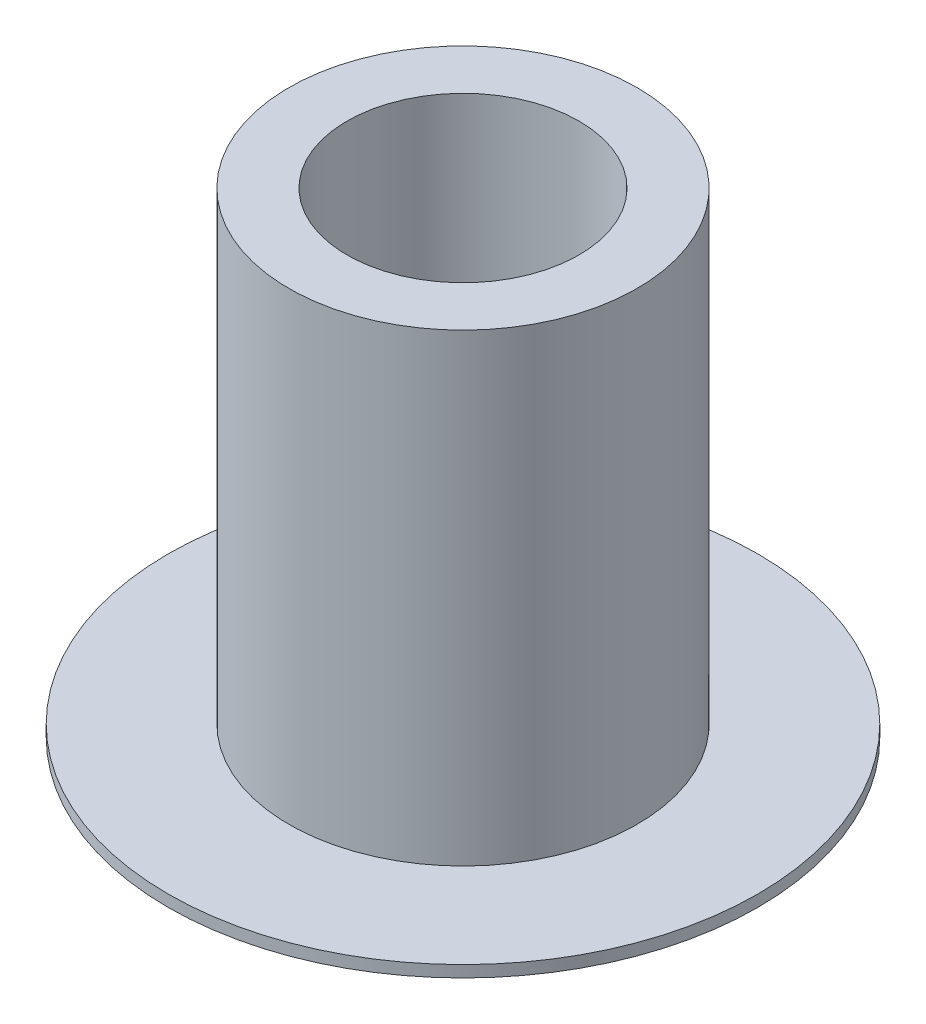
ISO-10303-21;
HEADER;
FILE_DESCRIPTION(('STEP AP214'),'2;1');
FILE_NAME('part.step','',(''),(''),'','','');
FILE_SCHEMA(('AUTOMOTIVE_DESIGN { 1 0 10303 214 1 1 1 1 }'));
ENDSEC;
DATA;
#1=APPLICATION_CONTEXT('core data for automotive mechanical design processes');
#2=APPLICATION_PROTOCOL_DEFINITION('international standard','automotive_design',2000,#1);
#3=PRODUCT_CONTEXT('',#1,'mechanical');
#4=PRODUCT('Part','Part','',(#3));
#5=PRODUCT_RELATED_PRODUCT_CATEGORY('part','',(#4));
#6=PRODUCT_DEFINITION_FORMATION('','',#4);
#7=PRODUCT_DEFINITION_CONTEXT('part definition',#1,'design');
#8=PRODUCT_DEFINITION('design','',#6,#7);
#9=PRODUCT_DEFINITION_SHAPE('','',#8);
#10=(LENGTH_UNIT() NAMED_UNIT(*) SI_UNIT(.MILLI.,.METRE.));
#11=(NAMED_UNIT(*) PLANE_ANGLE_UNIT() SI_UNIT($,.RADIAN.));
#12=(NAMED_UNIT(*) SI_UNIT($,.STERADIAN.) SOLID_ANGLE_UNIT());
#13=UNCERTAINTY_MEASURE_WITH_UNIT(LENGTH_MEASURE(1.E-05),#10,'distance_accuracy_value','');
#14=(GEOMETRIC_REPRESENTATION_CONTEXT(3) GLOBAL_UNCERTAINTY_ASSIGNED_CONTEXT((#13)) GLOBAL_UNIT_ASSIGNED_CONTEXT((#10,
#11,#12)) REPRESENTATION_CONTEXT('',''));
#15=CARTESIAN_POINT('',(0.,0.,0.));
#16=DIRECTION('',(0.,0.,1.));
#17=DIRECTION('',(1.,0.,0.));
#18=AXIS2_PLACEMENT_3D('',#15,#16,#17);
#19=CARTESIAN_POINT('',(0.,0.,0.));
#20=DIRECTION('',(0.,1.,0.));
#21=DIRECTION('',(0.,0.,1.));
#22=AXIS2_PLACEMENT_3D('',#19,#20,#21);
#23=PLANE('',#22);
#24=CARTESIAN_POINT('',(0.,0.,0.));
#25=DIRECTION('',(0.,-1.,0.));
#26=DIRECTION('',(0.,0.,-1.));
#27=AXIS2_PLACEMENT_3D('',#24,#25,#26);
#28=CIRCLE('',#27,0.4);
#29=CARTESIAN_POINT('',(0.,0.,-0.4));
#30=VERTEX_POINT('',#29);
#31=EDGE_CURVE('E34',#30,#30,#28,.F.);
#32=ORIENTED_EDGE('',*,*,#31,.T.);
#33=EDGE_LOOP('',(#32));
#34=FACE_BOUND('',#33,.T.);
#35=CARTESIAN_POINT('',(0.,0.,0.));
#36=DIRECTION('',(0.,1.,0.));
#37=DIRECTION('',(0.,0.,1.));
#38=AXIS2_PLACEMENT_3D('',#35,#36,#37);
#39=CIRCLE('',#38,1.016);
#40=CARTESIAN_POINT('',(0.,0.,1.016));
#41=VERTEX_POINT('',#40);
#42=EDGE_CURVE('E18',#41,#41,#39,.T.);
#43=ORIENTED_EDGE('',*,*,#42,.F.);
#44=EDGE_LOOP('',(#43));
#45=FACE_BOUND('',#44,.T.);
#46=ADVANCED_FACE('F15',(#34,#45),#23,.F.);
#47=CARTESIAN_POINT('',(0.,0.,0.));
#48=DIRECTION('',(0.,1.,0.));
#49=DIRECTION('',(0.,0.,1.));
#50=AXIS2_PLACEMENT_3D('',#47,#48,#49);
#51=CYLINDRICAL_SURFACE('',#50,1.016);
#52=ORIENTED_EDGE('',*,*,#42,.T.);
#53=EDGE_LOOP('',(#52));
#54=FACE_BOUND('',#53,.T.);
#55=CARTESIAN_POINT('',(0.,0.04,0.));
#56=DIRECTION('',(0.,1.,0.));
#57=DIRECTION('',(0.,0.,1.));
#58=AXIS2_PLACEMENT_3D('',#55,#56,#57);
#59=CIRCLE('',#58,1.016);
#60=CARTESIAN_POINT('',(0.,0.04,1.016));
#61=VERTEX_POINT('',#60);
#62=EDGE_CURVE('E32',#61,#61,#59,.T.);
#63=ORIENTED_EDGE('',*,*,#62,.F.);
#64=EDGE_LOOP('',(#63));
#65=FACE_BOUND('',#64,.T.);
#66=ADVANCED_FACE('F41',(#54,#65),#51,.T.);
#67=CARTESIAN_POINT('',(0.,1.64,0.));
#68=DIRECTION('',(0.,-1.,0.));
#69=DIRECTION('',(0.,0.,-1.));
#70=AXIS2_PLACEMENT_3D('',#67,#68,#69);
#71=CYLINDRICAL_SURFACE('',#70,0.4);
#72=ORIENTED_EDGE('',*,*,#31,.F.);
#73=EDGE_LOOP('',(#72));
#74=FACE_BOUND('',#73,.T.);
#75=CARTESIAN_POINT('',(0.,1.64,0.));
#76=DIRECTION('',(0.,-1.,0.));
#77=DIRECTION('',(0.,0.,-1.));
#78=AXIS2_PLACEMENT_3D('',#75,#76,#77);
#79=CIRCLE('',#78,0.4);
#80=CARTESIAN_POINT('',(0.,1.64,-0.4));
#81=VERTEX_POINT('',#80);
#82=EDGE_CURVE('E27',#81,#81,#79,.T.);
#83=ORIENTED_EDGE('',*,*,#82,.F.);
#84=EDGE_LOOP('',(#83));
#85=FACE_BOUND('',#84,.T.);
#86=ADVANCED_FACE('F49',(#74,#85),#71,.F.);
#87=CARTESIAN_POINT('',(0.,0.04,0.));
#88=DIRECTION('',(0.,1.,0.));
#89=DIRECTION('',(0.,0.,1.));
#90=AXIS2_PLACEMENT_3D('',#87,#88,#89);
#91=PLANE('',#90);
#92=CARTESIAN_POINT('',(0.,0.0400000000000001,0.));
#93=DIRECTION('',(0.,-1.,0.));
#94=DIRECTION('',(0.,0.,-1.));
#95=AXIS2_PLACEMENT_3D('',#92,#93,#94);
#96=CIRCLE('',#95,0.6);
#97=CARTESIAN_POINT('',(0.,0.0400000000000001,-0.6));
#98=VERTEX_POINT('',#97);
#99=EDGE_CURVE('E22',#98,#98,#96,.F.);
#100=ORIENTED_EDGE('',*,*,#99,.F.);
#101=EDGE_LOOP('',(#100));
#102=FACE_BOUND('',#101,.T.);
#103=ORIENTED_EDGE('',*,*,#62,.T.);
#104=EDGE_LOOP('',(#103));
#105=FACE_BOUND('',#104,.T.);
#106=ADVANCED_FACE('F57',(#102,#105),#91,.T.);
#107=CARTESIAN_POINT('',(0.,1.64,0.));
#108=DIRECTION('',(0.,1.,0.));
#109=DIRECTION('',(0.,0.,1.));
#110=AXIS2_PLACEMENT_3D('',#107,#108,#109);
#111=PLANE('',#110);
#112=ORIENTED_EDGE('',*,*,#82,.T.);
#113=EDGE_LOOP('',(#112));
#114=FACE_BOUND('',#113,.T.);
#115=CARTESIAN_POINT('',(0.,1.64,0.));
#116=DIRECTION('',(0.,-1.,0.));
#117=DIRECTION('',(0.,0.,-1.));
#118=AXIS2_PLACEMENT_3D('',#115,#116,#117);
#119=CIRCLE('',#118,0.6);
#120=CARTESIAN_POINT('',(0.,1.64,-0.6));
#121=VERTEX_POINT('',#120);
#122=EDGE_CURVE('E10',#121,#121,#119,.T.);
#123=ORIENTED_EDGE('',*,*,#122,.F.);
#124=EDGE_LOOP('',(#123));
#125=FACE_BOUND('',#124,.T.);
#126=ADVANCED_FACE('F52',(#114,#125),#111,.T.);
#127=CARTESIAN_POINT('',(0.,1.64,0.));
#128=DIRECTION('',(0.,-1.,0.));
#129=DIRECTION('',(0.,0.,-1.));
#130=AXIS2_PLACEMENT_3D('',#127,#128,#129);
#131=CYLINDRICAL_SURFACE('',#130,0.6);
#132=ORIENTED_EDGE('',*,*,#122,.T.);
#133=EDGE_LOOP('',(#132));
#134=FACE_BOUND('',#133,.T.);
#135=ORIENTED_EDGE('',*,*,#99,.T.);
#136=EDGE_LOOP('',(#135));
#137=FACE_BOUND('',#136,.T.);
#138=ADVANCED_FACE('F50',(#134,#137),#131,.T.);
#139=CLOSED_SHELL('',(#46,#66,#86,#106,#126,#138));
#140=MANIFOLD_SOLID_BREP('B1',#139);
#141=ADVANCED_BREP_SHAPE_REPRESENTATION('',(#18,#140),#14);
#142=SHAPE_DEFINITION_REPRESENTATION(#9,#141);
ENDSEC;
END-ISO-10303-21;
